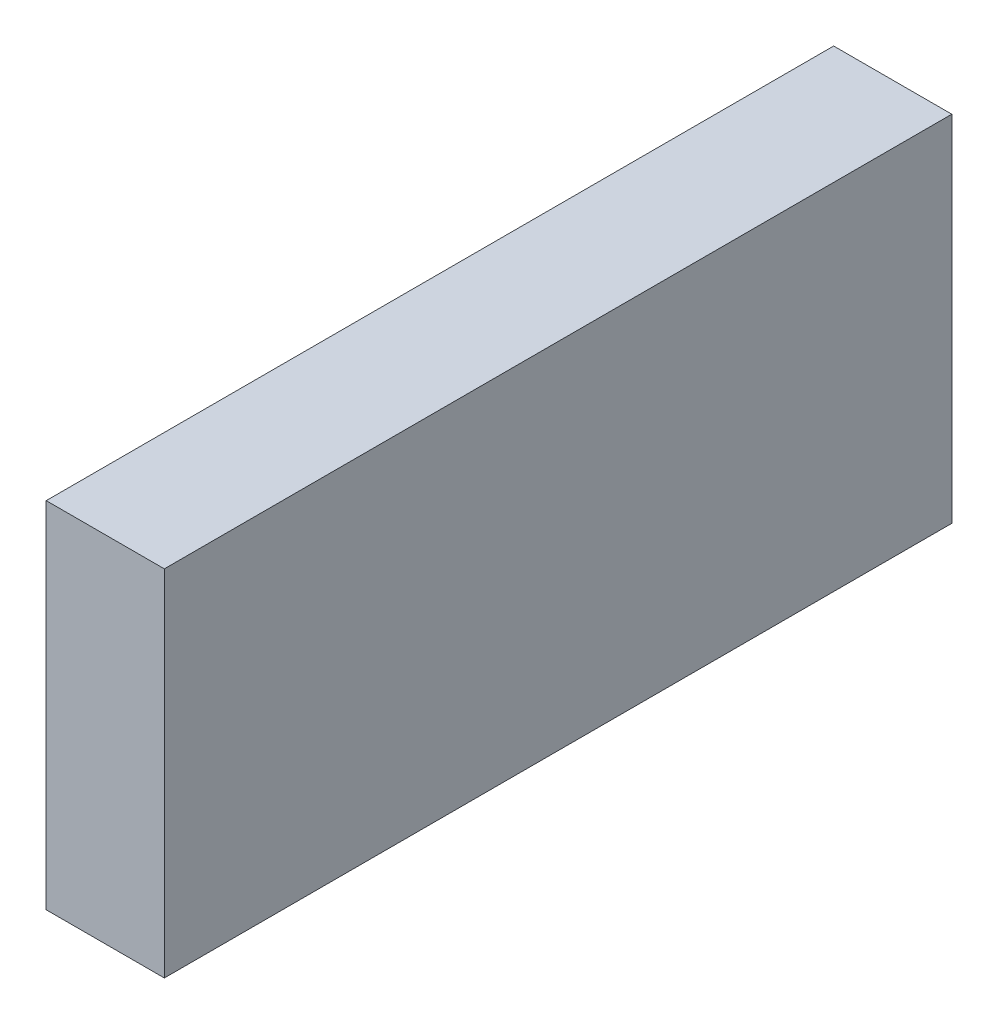
ISO-10303-21;
HEADER;
FILE_DESCRIPTION(('STEP AP214'),'2;1');
FILE_NAME('part.step','',(''),(''),'','','');
FILE_SCHEMA(('AUTOMOTIVE_DESIGN { 1 0 10303 214 1 1 1 1 }'));
ENDSEC;
DATA;
#1=APPLICATION_CONTEXT('core data for automotive mechanical design processes');
#2=APPLICATION_PROTOCOL_DEFINITION('international standard','automotive_design',2000,#1);
#3=PRODUCT_CONTEXT('',#1,'mechanical');
#4=PRODUCT('Part','Part','',(#3));
#5=PRODUCT_RELATED_PRODUCT_CATEGORY('part','',(#4));
#6=PRODUCT_DEFINITION_FORMATION('','',#4);
#7=PRODUCT_DEFINITION_CONTEXT('part definition',#1,'design');
#8=PRODUCT_DEFINITION('design','',#6,#7);
#9=PRODUCT_DEFINITION_SHAPE('','',#8);
#10=(LENGTH_UNIT() NAMED_UNIT(*) SI_UNIT(.MILLI.,.METRE.));
#11=(NAMED_UNIT(*) PLANE_ANGLE_UNIT() SI_UNIT($,.RADIAN.));
#12=(NAMED_UNIT(*) SI_UNIT($,.STERADIAN.) SOLID_ANGLE_UNIT());
#13=UNCERTAINTY_MEASURE_WITH_UNIT(LENGTH_MEASURE(1.E-05),#10,'distance_accuracy_value','');
#14=(GEOMETRIC_REPRESENTATION_CONTEXT(3) GLOBAL_UNCERTAINTY_ASSIGNED_CONTEXT((#13)) GLOBAL_UNIT_ASSIGNED_CONTEXT((#10,
#11,#12)) REPRESENTATION_CONTEXT('',''));
#15=CARTESIAN_POINT('',(0.,0.,0.));
#16=DIRECTION('',(0.,0.,1.));
#17=DIRECTION('',(1.,0.,0.));
#18=AXIS2_PLACEMENT_3D('',#15,#16,#17);
#19=CARTESIAN_POINT('',(15.,-45.,100.));
#20=DIRECTION('',(-1.,0.,0.));
#21=DIRECTION('',(0.,0.,1.));
#22=AXIS2_PLACEMENT_3D('',#19,#20,#21);
#23=PLANE('',#22);
#24=DIRECTION('',(0.,1.,0.));
#25=VECTOR('',#24,1.);
#26=CARTESIAN_POINT('',(15.,-45.,-100.));
#27=LINE('',#26,#25);
#28=CARTESIAN_POINT('',(15.,-45.,-100.));
#29=VERTEX_POINT('',#28);
#30=CARTESIAN_POINT('',(15.,45.,-100.));
#31=VERTEX_POINT('',#30);
#32=EDGE_CURVE('E96',#29,#31,#27,.T.);
#33=ORIENTED_EDGE('',*,*,#32,.T.);
#34=DIRECTION('',(0.,0.,-1.));
#35=VECTOR('',#34,1.);
#36=CARTESIAN_POINT('',(15.,45.,100.));
#37=LINE('',#36,#35);
#38=CARTESIAN_POINT('',(15.,45.,100.));
#39=VERTEX_POINT('',#38);
#40=EDGE_CURVE('E11',#39,#31,#37,.T.);
#41=ORIENTED_EDGE('',*,*,#40,.F.);
#42=DIRECTION('',(0.,1.,0.));
#43=VECTOR('',#42,1.);
#44=CARTESIAN_POINT('',(15.,-45.,100.));
#45=LINE('',#44,#43);
#46=CARTESIAN_POINT('',(15.,-45.,100.));
#47=VERTEX_POINT('',#46);
#48=EDGE_CURVE('E84',#47,#39,#45,.T.);
#49=ORIENTED_EDGE('',*,*,#48,.F.);
#50=DIRECTION('',(0.,0.,-1.));
#51=VECTOR('',#50,1.);
#52=CARTESIAN_POINT('',(15.,-45.,100.));
#53=LINE('',#52,#51);
#54=EDGE_CURVE('E92',#47,#29,#53,.T.);
#55=ORIENTED_EDGE('',*,*,#54,.T.);
#56=EDGE_LOOP('',(#33,#41,#49,#55));
#57=FACE_BOUND('',#56,.T.);
#58=ADVANCED_FACE('F33',(#57),#23,.F.);
#59=CARTESIAN_POINT('',(-15.,45.,100.));
#60=DIRECTION('',(0.,-1.,0.));
#61=DIRECTION('',(0.,0.,-1.));
#62=AXIS2_PLACEMENT_3D('',#59,#60,#61);
#63=PLANE('',#62);
#64=DIRECTION('',(-1.,0.,0.));
#65=VECTOR('',#64,1.);
#66=CARTESIAN_POINT('',(-15.,45.,-100.));
#67=LINE('',#66,#65);
#68=CARTESIAN_POINT('',(-15.,45.,-100.));
#69=VERTEX_POINT('',#68);
#70=EDGE_CURVE('E88',#31,#69,#67,.T.);
#71=ORIENTED_EDGE('',*,*,#70,.T.);
#72=DIRECTION('',(0.,0.,-1.));
#73=VECTOR('',#72,1.);
#74=CARTESIAN_POINT('',(-15.,45.,100.));
#75=LINE('',#74,#73);
#76=CARTESIAN_POINT('',(-15.,45.,100.));
#77=VERTEX_POINT('',#76);
#78=EDGE_CURVE('E41',#77,#69,#75,.T.);
#79=ORIENTED_EDGE('',*,*,#78,.F.);
#80=DIRECTION('',(-1.,0.,0.));
#81=VECTOR('',#80,1.);
#82=CARTESIAN_POINT('',(-15.,45.,100.));
#83=LINE('',#82,#81);
#84=EDGE_CURVE('E79',#39,#77,#83,.T.);
#85=ORIENTED_EDGE('',*,*,#84,.F.);
#86=ORIENTED_EDGE('',*,*,#40,.T.);
#87=EDGE_LOOP('',(#71,#79,#85,#86));
#88=FACE_BOUND('',#87,.T.);
#89=ADVANCED_FACE('F87',(#88),#63,.F.);
#90=CARTESIAN_POINT('',(-15.,-45.,100.));
#91=DIRECTION('',(1.,0.,0.));
#92=DIRECTION('',(0.,0.,-1.));
#93=AXIS2_PLACEMENT_3D('',#90,#91,#92);
#94=PLANE('',#93);
#95=DIRECTION('',(0.,-1.,0.));
#96=VECTOR('',#95,1.);
#97=CARTESIAN_POINT('',(-15.,-45.,-100.));
#98=LINE('',#97,#96);
#99=CARTESIAN_POINT('',(-15.,-45.,-100.));
#100=VERTEX_POINT('',#99);
#101=EDGE_CURVE('E66',#69,#100,#98,.T.);
#102=ORIENTED_EDGE('',*,*,#101,.T.);
#103=DIRECTION('',(0.,0.,-1.));
#104=VECTOR('',#103,1.);
#105=CARTESIAN_POINT('',(-15.,-45.,100.));
#106=LINE('',#105,#104);
#107=CARTESIAN_POINT('',(-15.,-45.,100.));
#108=VERTEX_POINT('',#107);
#109=EDGE_CURVE('E89',#108,#100,#106,.T.);
#110=ORIENTED_EDGE('',*,*,#109,.F.);
#111=DIRECTION('',(0.,-1.,0.));
#112=VECTOR('',#111,1.);
#113=CARTESIAN_POINT('',(-15.,-45.,100.));
#114=LINE('',#113,#112);
#115=EDGE_CURVE('E82',#77,#108,#114,.T.);
#116=ORIENTED_EDGE('',*,*,#115,.F.);
#117=ORIENTED_EDGE('',*,*,#78,.T.);
#118=EDGE_LOOP('',(#102,#110,#116,#117));
#119=FACE_BOUND('',#118,.T.);
#120=ADVANCED_FACE('F90',(#119),#94,.F.);
#121=CARTESIAN_POINT('',(-15.,-45.,100.));
#122=DIRECTION('',(0.,1.,0.));
#123=DIRECTION('',(0.,0.,1.));
#124=AXIS2_PLACEMENT_3D('',#121,#122,#123);
#125=PLANE('',#124);
#126=DIRECTION('',(1.,0.,0.));
#127=VECTOR('',#126,1.);
#128=CARTESIAN_POINT('',(-15.,-45.,-100.));
#129=LINE('',#128,#127);
#130=EDGE_CURVE('E72',#100,#29,#129,.T.);
#131=ORIENTED_EDGE('',*,*,#130,.T.);
#132=ORIENTED_EDGE('',*,*,#54,.F.);
#133=DIRECTION('',(1.,0.,0.));
#134=VECTOR('',#133,1.);
#135=CARTESIAN_POINT('',(-15.,-45.,100.));
#136=LINE('',#135,#134);
#137=EDGE_CURVE('E49',#108,#47,#136,.T.);
#138=ORIENTED_EDGE('',*,*,#137,.F.);
#139=ORIENTED_EDGE('',*,*,#109,.T.);
#140=EDGE_LOOP('',(#131,#132,#138,#139));
#141=FACE_BOUND('',#140,.T.);
#142=ADVANCED_FACE('F103',(#141),#125,.F.);
#143=CARTESIAN_POINT('',(0.,0.,100.));
#144=DIRECTION('',(0.,0.,-1.));
#145=DIRECTION('',(-1.,0.,0.));
#146=AXIS2_PLACEMENT_3D('',#143,#144,#145);
#147=PLANE('',#146);
#148=ORIENTED_EDGE('',*,*,#48,.T.);
#149=ORIENTED_EDGE('',*,*,#84,.T.);
#150=ORIENTED_EDGE('',*,*,#115,.T.);
#151=ORIENTED_EDGE('',*,*,#137,.T.);
#152=EDGE_LOOP('',(#148,#149,#150,#151));
#153=FACE_BOUND('',#152,.T.);
#154=ADVANCED_FACE('F80',(#153),#147,.F.);
#155=CARTESIAN_POINT('',(0.,0.,-100.));
#156=DIRECTION('',(0.,0.,-1.));
#157=DIRECTION('',(-1.,0.,0.));
#158=AXIS2_PLACEMENT_3D('',#155,#156,#157);
#159=PLANE('',#158);
#160=ORIENTED_EDGE('',*,*,#32,.F.);
#161=ORIENTED_EDGE('',*,*,#130,.F.);
#162=ORIENTED_EDGE('',*,*,#101,.F.);
#163=ORIENTED_EDGE('',*,*,#70,.F.);
#164=EDGE_LOOP('',(#160,#161,#162,#163));
#165=FACE_BOUND('',#164,.T.);
#166=ADVANCED_FACE('F106',(#165),#159,.T.);
#167=CLOSED_SHELL('',(#58,#89,#120,#142,#154,#166));
#168=MANIFOLD_SOLID_BREP('B2',#167);
#169=ADVANCED_BREP_SHAPE_REPRESENTATION('',(#18,#168),#14);
#170=SHAPE_DEFINITION_REPRESENTATION(#9,#169);
ENDSEC;
END-ISO-10303-21;
